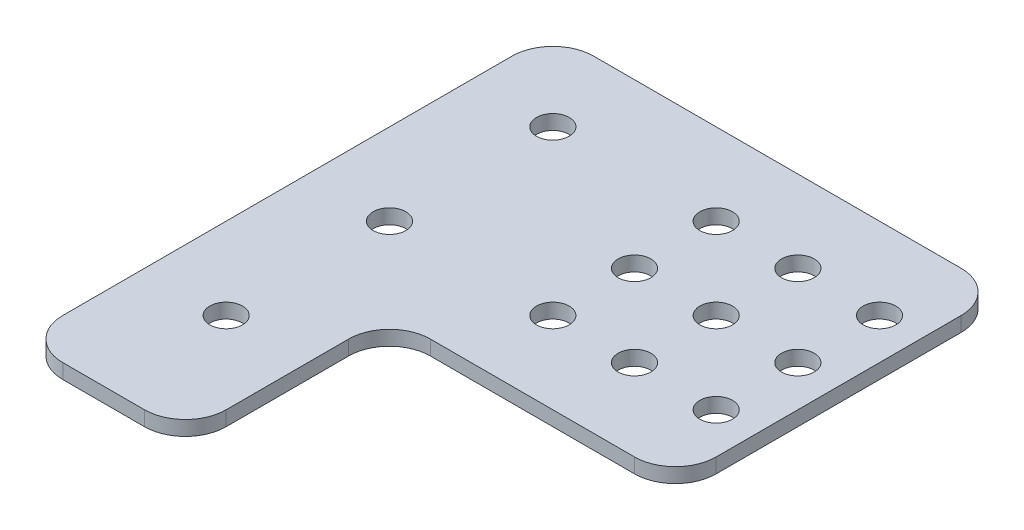
ISO-10303-21;
HEADER;
FILE_DESCRIPTION(('STEP AP214'),'2;1');
FILE_NAME('part.step','',(''),(''),'','','');
FILE_SCHEMA(('AUTOMOTIVE_DESIGN { 1 0 10303 214 1 1 1 1 }'));
ENDSEC;
DATA;
#1=APPLICATION_CONTEXT('core data for automotive mechanical design processes');
#2=APPLICATION_PROTOCOL_DEFINITION('international standard','automotive_design',2000,#1);
#3=PRODUCT_CONTEXT('',#1,'mechanical');
#4=PRODUCT('Part','Part','',(#3));
#5=PRODUCT_RELATED_PRODUCT_CATEGORY('part','',(#4));
#6=PRODUCT_DEFINITION_FORMATION('','',#4);
#7=PRODUCT_DEFINITION_CONTEXT('part definition',#1,'design');
#8=PRODUCT_DEFINITION('design','',#6,#7);
#9=PRODUCT_DEFINITION_SHAPE('','',#8);
#10=(LENGTH_UNIT() NAMED_UNIT(*) SI_UNIT(.MILLI.,.METRE.));
#11=(NAMED_UNIT(*) PLANE_ANGLE_UNIT() SI_UNIT($,.RADIAN.));
#12=(NAMED_UNIT(*) SI_UNIT($,.STERADIAN.) SOLID_ANGLE_UNIT());
#13=UNCERTAINTY_MEASURE_WITH_UNIT(LENGTH_MEASURE(1.E-05),#10,'distance_accuracy_value','');
#14=(GEOMETRIC_REPRESENTATION_CONTEXT(3) GLOBAL_UNCERTAINTY_ASSIGNED_CONTEXT((#13)) GLOBAL_UNIT_ASSIGNED_CONTEXT((#10,
#11,#12)) REPRESENTATION_CONTEXT('',''));
#15=CARTESIAN_POINT('',(0.,0.,0.));
#16=DIRECTION('',(0.,0.,1.));
#17=DIRECTION('',(1.,0.,0.));
#18=AXIS2_PLACEMENT_3D('',#15,#16,#17);
#19=CARTESIAN_POINT('',(0.,2.286,0.));
#20=DIRECTION('',(0.,1.,0.));
#21=DIRECTION('',(0.,0.,1.));
#22=AXIS2_PLACEMENT_3D('',#19,#20,#21);
#23=PLANE('',#22);
#24=DIRECTION('',(-1.,0.,0.));
#25=VECTOR('',#24,1.);
#26=CARTESIAN_POINT('',(69.85,2.286,-82.55));
#27=LINE('',#26,#25);
#28=CARTESIAN_POINT('',(63.5,2.286,-82.55));
#29=VERTEX_POINT('',#28);
#30=CARTESIAN_POINT('',(6.35000000000002,2.286,-82.55));
#31=VERTEX_POINT('',#30);
#32=EDGE_CURVE('E132',#29,#31,#27,.T.);
#33=ORIENTED_EDGE('',*,*,#32,.T.);
#34=CARTESIAN_POINT('',(6.34999999999999,2.286,-76.2));
#35=DIRECTION('',(0.,1.,0.));
#36=DIRECTION('',(0.,0.,1.));
#37=AXIS2_PLACEMENT_3D('',#34,#35,#36);
#38=CIRCLE('',#37,6.35);
#39=CARTESIAN_POINT('',(0.,2.286,-76.2));
#40=VERTEX_POINT('',#39);
#41=EDGE_CURVE('E126',#31,#40,#38,.T.);
#42=ORIENTED_EDGE('',*,*,#41,.T.);
#43=DIRECTION('',(0.,0.,1.));
#44=VECTOR('',#43,1.);
#45=CARTESIAN_POINT('',(0.,2.286,-114.3));
#46=LINE('',#45,#44);
#47=CARTESIAN_POINT('',(0.,2.286,-6.34999999999999));
#48=VERTEX_POINT('',#47);
#49=EDGE_CURVE('E129',#40,#48,#46,.T.);
#50=ORIENTED_EDGE('',*,*,#49,.T.);
#51=CARTESIAN_POINT('',(6.35,2.286,-6.35));
#52=DIRECTION('',(0.,1.,0.));
#53=DIRECTION('',(0.,0.,1.));
#54=AXIS2_PLACEMENT_3D('',#51,#52,#53);
#55=CIRCLE('',#54,6.35);
#56=CARTESIAN_POINT('',(6.35,2.286,0.));
#57=VERTEX_POINT('',#56);
#58=EDGE_CURVE('E170',#48,#57,#55,.T.);
#59=ORIENTED_EDGE('',*,*,#58,.T.);
#60=DIRECTION('',(1.,0.,0.));
#61=VECTOR('',#60,1.);
#62=CARTESIAN_POINT('',(0.,2.286,0.));
#63=LINE('',#62,#61);
#64=CARTESIAN_POINT('',(19.05,2.286,0.));
#65=VERTEX_POINT('',#64);
#66=EDGE_CURVE('E147',#57,#65,#63,.T.);
#67=ORIENTED_EDGE('',*,*,#66,.T.);
#68=CARTESIAN_POINT('',(19.05,2.286,-6.35));
#69=DIRECTION('',(0.,1.,0.));
#70=DIRECTION('',(0.,0.,1.));
#71=AXIS2_PLACEMENT_3D('',#68,#69,#70);
#72=CIRCLE('',#71,6.35);
#73=CARTESIAN_POINT('',(25.4,2.286,-6.35));
#74=VERTEX_POINT('',#73);
#75=EDGE_CURVE('E172',#65,#74,#72,.T.);
#76=ORIENTED_EDGE('',*,*,#75,.T.);
#77=DIRECTION('',(0.,0.,-1.));
#78=VECTOR('',#77,1.);
#79=CARTESIAN_POINT('',(25.4,2.286,0.));
#80=LINE('',#79,#78);
#81=CARTESIAN_POINT('',(25.4,2.286,-25.4));
#82=VERTEX_POINT('',#81);
#83=EDGE_CURVE('E216',#74,#82,#80,.T.);
#84=ORIENTED_EDGE('',*,*,#83,.T.);
#85=CARTESIAN_POINT('',(31.75,2.286,-25.4));
#86=DIRECTION('',(0.,1.,0.));
#87=DIRECTION('',(0.,0.,1.));
#88=AXIS2_PLACEMENT_3D('',#85,#86,#87);
#89=CIRCLE('',#88,6.35);
#90=CARTESIAN_POINT('',(31.75,2.286,-31.75));
#91=VERTEX_POINT('',#90);
#92=EDGE_CURVE('E11',#82,#91,#89,.F.);
#93=ORIENTED_EDGE('',*,*,#92,.T.);
#94=DIRECTION('',(1.,0.,0.));
#95=VECTOR('',#94,1.);
#96=CARTESIAN_POINT('',(25.4,2.286,-31.75));
#97=LINE('',#96,#95);
#98=CARTESIAN_POINT('',(63.5,2.286,-31.75));
#99=VERTEX_POINT('',#98);
#100=EDGE_CURVE('E215',#91,#99,#97,.T.);
#101=ORIENTED_EDGE('',*,*,#100,.T.);
#102=CARTESIAN_POINT('',(63.5,2.286,-38.1));
#103=DIRECTION('',(0.,1.,0.));
#104=DIRECTION('',(0.,0.,1.));
#105=AXIS2_PLACEMENT_3D('',#102,#103,#104);
#106=CIRCLE('',#105,6.35);
#107=CARTESIAN_POINT('',(69.85,2.286,-38.1));
#108=VERTEX_POINT('',#107);
#109=EDGE_CURVE('E58',#99,#108,#106,.T.);
#110=ORIENTED_EDGE('',*,*,#109,.T.);
#111=DIRECTION('',(0.,0.,-1.));
#112=VECTOR('',#111,1.);
#113=CARTESIAN_POINT('',(69.85,2.286,-31.75));
#114=LINE('',#113,#112);
#115=CARTESIAN_POINT('',(69.85,2.286,-76.2));
#116=VERTEX_POINT('',#115);
#117=EDGE_CURVE('E220',#108,#116,#114,.T.);
#118=ORIENTED_EDGE('',*,*,#117,.T.);
#119=CARTESIAN_POINT('',(63.5,2.286,-76.2));
#120=DIRECTION('',(0.,1.,0.));
#121=DIRECTION('',(0.,0.,1.));
#122=AXIS2_PLACEMENT_3D('',#119,#120,#121);
#123=CIRCLE('',#122,6.35);
#124=EDGE_CURVE('E137',#116,#29,#123,.T.);
#125=ORIENTED_EDGE('',*,*,#124,.T.);
#126=EDGE_LOOP('',(#33,#42,#50,#59,#67,#76,#84,#93,#101,#110,#118,#125));
#127=FACE_BOUND('',#126,.T.);
#128=CARTESIAN_POINT('',(38.1000000000001,2.286,-57.15));
#129=DIRECTION('',(0.,1.,0.));
#130=DIRECTION('',(0.,0.,1.));
#131=AXIS2_PLACEMENT_3D('',#128,#129,#130);
#132=CIRCLE('',#131,2.53999999999999);
#133=CARTESIAN_POINT('',(38.1000000000001,2.286,-54.61));
#134=VERTEX_POINT('',#133);
#135=EDGE_CURVE('E307',#134,#134,#132,.T.);
#136=ORIENTED_EDGE('',*,*,#135,.F.);
#137=EDGE_LOOP('',(#136));
#138=FACE_BOUND('',#137,.T.);
#139=CARTESIAN_POINT('',(50.8000000000002,2.286,-44.45));
#140=DIRECTION('',(0.,1.,0.));
#141=DIRECTION('',(0.,0.,1.));
#142=AXIS2_PLACEMENT_3D('',#139,#140,#141);
#143=CIRCLE('',#142,2.54);
#144=CARTESIAN_POINT('',(50.8000000000002,2.286,-41.91));
#145=VERTEX_POINT('',#144);
#146=EDGE_CURVE('E295',#145,#145,#143,.T.);
#147=ORIENTED_EDGE('',*,*,#146,.F.);
#148=EDGE_LOOP('',(#147));
#149=FACE_BOUND('',#148,.T.);
#150=CARTESIAN_POINT('',(50.8000000000001,2.286,-57.15));
#151=DIRECTION('',(0.,1.,0.));
#152=DIRECTION('',(0.,0.,1.));
#153=AXIS2_PLACEMENT_3D('',#150,#151,#152);
#154=CIRCLE('',#153,2.53999999999999);
#155=CARTESIAN_POINT('',(50.8000000000001,2.286,-54.61));
#156=VERTEX_POINT('',#155);
#157=EDGE_CURVE('E283',#156,#156,#154,.T.);
#158=ORIENTED_EDGE('',*,*,#157,.F.);
#159=EDGE_LOOP('',(#158));
#160=FACE_BOUND('',#159,.T.);
#161=CARTESIAN_POINT('',(50.8,2.286,-69.85));
#162=DIRECTION('',(0.,1.,0.));
#163=DIRECTION('',(0.,0.,1.));
#164=AXIS2_PLACEMENT_3D('',#161,#162,#163);
#165=CIRCLE('',#164,2.53999999999999);
#166=CARTESIAN_POINT('',(50.8,2.286,-67.31));
#167=VERTEX_POINT('',#166);
#168=EDGE_CURVE('E271',#167,#167,#165,.T.);
#169=ORIENTED_EDGE('',*,*,#168,.F.);
#170=EDGE_LOOP('',(#169));
#171=FACE_BOUND('',#170,.T.);
#172=CARTESIAN_POINT('',(12.7,2.286,-44.45));
#173=DIRECTION('',(0.,1.,0.));
#174=DIRECTION('',(0.,0.,1.));
#175=AXIS2_PLACEMENT_3D('',#172,#173,#174);
#176=CIRCLE('',#175,2.54);
#177=CARTESIAN_POINT('',(12.7,2.286,-41.91));
#178=VERTEX_POINT('',#177);
#179=EDGE_CURVE('E259',#178,#178,#176,.T.);
#180=ORIENTED_EDGE('',*,*,#179,.F.);
#181=EDGE_LOOP('',(#180));
#182=FACE_BOUND('',#181,.T.);
#183=CARTESIAN_POINT('',(38.1,2.286,-69.85));
#184=DIRECTION('',(0.,1.,0.));
#185=DIRECTION('',(0.,0.,1.));
#186=AXIS2_PLACEMENT_3D('',#183,#184,#185);
#187=CIRCLE('',#186,2.53999999999999);
#188=CARTESIAN_POINT('',(38.1,2.286,-67.31));
#189=VERTEX_POINT('',#188);
#190=EDGE_CURVE('E229',#189,#189,#187,.T.);
#191=ORIENTED_EDGE('',*,*,#190,.F.);
#192=EDGE_LOOP('',(#191));
#193=FACE_BOUND('',#192,.T.);
#194=CARTESIAN_POINT('',(12.7,2.286,-69.85));
#195=DIRECTION('',(0.,1.,0.));
#196=DIRECTION('',(0.,0.,1.));
#197=AXIS2_PLACEMENT_3D('',#194,#195,#196);
#198=CIRCLE('',#197,2.53999999999999);
#199=CARTESIAN_POINT('',(12.7,2.286,-67.31));
#200=VERTEX_POINT('',#199);
#201=EDGE_CURVE('E253',#200,#200,#198,.T.);
#202=ORIENTED_EDGE('',*,*,#201,.F.);
#203=EDGE_LOOP('',(#202));
#204=FACE_BOUND('',#203,.T.);
#205=CARTESIAN_POINT('',(12.7,2.286,-19.05));
#206=DIRECTION('',(0.,1.,0.));
#207=DIRECTION('',(0.,0.,1.));
#208=AXIS2_PLACEMENT_3D('',#205,#206,#207);
#209=CIRCLE('',#208,2.53999999999999);
#210=CARTESIAN_POINT('',(12.7,2.286,-16.51));
#211=VERTEX_POINT('',#210);
#212=EDGE_CURVE('E265',#211,#211,#209,.T.);
#213=ORIENTED_EDGE('',*,*,#212,.F.);
#214=EDGE_LOOP('',(#213));
#215=FACE_BOUND('',#214,.T.);
#216=CARTESIAN_POINT('',(63.5,2.286,-69.85));
#217=DIRECTION('',(0.,1.,0.));
#218=DIRECTION('',(0.,0.,1.));
#219=AXIS2_PLACEMENT_3D('',#216,#217,#218);
#220=CIRCLE('',#219,2.54000000000001);
#221=CARTESIAN_POINT('',(63.5,2.286,-67.31));
#222=VERTEX_POINT('',#221);
#223=EDGE_CURVE('E277',#222,#222,#220,.T.);
#224=ORIENTED_EDGE('',*,*,#223,.F.);
#225=EDGE_LOOP('',(#224));
#226=FACE_BOUND('',#225,.T.);
#227=CARTESIAN_POINT('',(63.5000000000001,2.286,-57.15));
#228=DIRECTION('',(0.,1.,0.));
#229=DIRECTION('',(0.,0.,1.));
#230=AXIS2_PLACEMENT_3D('',#227,#228,#229);
#231=CIRCLE('',#230,2.53999999999999);
#232=CARTESIAN_POINT('',(63.5000000000001,2.286,-54.61));
#233=VERTEX_POINT('',#232);
#234=EDGE_CURVE('E289',#233,#233,#231,.T.);
#235=ORIENTED_EDGE('',*,*,#234,.F.);
#236=EDGE_LOOP('',(#235));
#237=FACE_BOUND('',#236,.T.);
#238=CARTESIAN_POINT('',(63.5000000000002,2.286,-44.45));
#239=DIRECTION('',(0.,1.,0.));
#240=DIRECTION('',(0.,0.,1.));
#241=AXIS2_PLACEMENT_3D('',#238,#239,#240);
#242=CIRCLE('',#241,2.53999999999998);
#243=CARTESIAN_POINT('',(63.5000000000002,2.286,-41.91));
#244=VERTEX_POINT('',#243);
#245=EDGE_CURVE('E301',#244,#244,#242,.T.);
#246=ORIENTED_EDGE('',*,*,#245,.F.);
#247=EDGE_LOOP('',(#246));
#248=FACE_BOUND('',#247,.T.);
#249=CARTESIAN_POINT('',(38.1000000000002,2.286,-44.45));
#250=DIRECTION('',(0.,1.,0.));
#251=DIRECTION('',(0.,0.,1.));
#252=AXIS2_PLACEMENT_3D('',#249,#250,#251);
#253=CIRCLE('',#252,2.54);
#254=CARTESIAN_POINT('',(38.1000000000002,2.286,-41.91));
#255=VERTEX_POINT('',#254);
#256=EDGE_CURVE('E313',#255,#255,#253,.T.);
#257=ORIENTED_EDGE('',*,*,#256,.F.);
#258=EDGE_LOOP('',(#257));
#259=FACE_BOUND('',#258,.T.);
#260=ADVANCED_FACE('F36',(#127,#138,#149,#160,#171,#182,#193,#204,#215,#226,#237,#248,#259),#23,.T.);
#261=CARTESIAN_POINT('',(0.,0.,0.));
#262=DIRECTION('',(0.,1.,0.));
#263=DIRECTION('',(0.,0.,1.));
#264=AXIS2_PLACEMENT_3D('',#261,#262,#263);
#265=PLANE('',#264);
#266=DIRECTION('',(0.,0.,1.));
#267=VECTOR('',#266,1.);
#268=CARTESIAN_POINT('',(0.,0.,-114.3));
#269=LINE('',#268,#267);
#270=CARTESIAN_POINT('',(0.,0.,-76.2));
#271=VERTEX_POINT('',#270);
#272=CARTESIAN_POINT('',(0.,0.,-6.34999999999999));
#273=VERTEX_POINT('',#272);
#274=EDGE_CURVE('E227',#271,#273,#269,.T.);
#275=ORIENTED_EDGE('',*,*,#274,.F.);
#276=CARTESIAN_POINT('',(6.34999999999999,0.,-76.2));
#277=DIRECTION('',(0.,1.,0.));
#278=DIRECTION('',(0.,0.,1.));
#279=AXIS2_PLACEMENT_3D('',#276,#277,#278);
#280=CIRCLE('',#279,6.35);
#281=CARTESIAN_POINT('',(6.35000000000002,0.,-82.55));
#282=VERTEX_POINT('',#281);
#283=EDGE_CURVE('E151',#271,#282,#280,.F.);
#284=ORIENTED_EDGE('',*,*,#283,.T.);
#285=DIRECTION('',(-1.,0.,0.));
#286=VECTOR('',#285,1.);
#287=CARTESIAN_POINT('',(69.85,0.,-82.55));
#288=LINE('',#287,#286);
#289=CARTESIAN_POINT('',(63.5,0.,-82.55));
#290=VERTEX_POINT('',#289);
#291=EDGE_CURVE('E148',#290,#282,#288,.T.);
#292=ORIENTED_EDGE('',*,*,#291,.F.);
#293=CARTESIAN_POINT('',(63.5,0.,-76.2));
#294=DIRECTION('',(0.,1.,0.));
#295=DIRECTION('',(0.,0.,1.));
#296=AXIS2_PLACEMENT_3D('',#293,#294,#295);
#297=CIRCLE('',#296,6.35);
#298=CARTESIAN_POINT('',(69.85,0.,-76.2));
#299=VERTEX_POINT('',#298);
#300=EDGE_CURVE('E162',#290,#299,#297,.F.);
#301=ORIENTED_EDGE('',*,*,#300,.T.);
#302=DIRECTION('',(0.,0.,-1.));
#303=VECTOR('',#302,1.);
#304=CARTESIAN_POINT('',(69.85,0.,-31.75));
#305=LINE('',#304,#303);
#306=CARTESIAN_POINT('',(69.85,0.,-38.1));
#307=VERTEX_POINT('',#306);
#308=EDGE_CURVE('E233',#307,#299,#305,.T.);
#309=ORIENTED_EDGE('',*,*,#308,.F.);
#310=CARTESIAN_POINT('',(63.5,0.,-38.1));
#311=DIRECTION('',(0.,1.,0.));
#312=DIRECTION('',(0.,0.,1.));
#313=AXIS2_PLACEMENT_3D('',#310,#311,#312);
#314=CIRCLE('',#313,6.35);
#315=CARTESIAN_POINT('',(63.5,0.,-31.75));
#316=VERTEX_POINT('',#315);
#317=EDGE_CURVE('E160',#307,#316,#314,.F.);
#318=ORIENTED_EDGE('',*,*,#317,.T.);
#319=DIRECTION('',(1.,0.,0.));
#320=VECTOR('',#319,1.);
#321=CARTESIAN_POINT('',(25.4,0.,-31.75));
#322=LINE('',#321,#320);
#323=CARTESIAN_POINT('',(31.75,0.,-31.75));
#324=VERTEX_POINT('',#323);
#325=EDGE_CURVE('E201',#324,#316,#322,.T.);
#326=ORIENTED_EDGE('',*,*,#325,.F.);
#327=CARTESIAN_POINT('',(31.75,0.,-25.4));
#328=DIRECTION('',(0.,1.,0.));
#329=DIRECTION('',(0.,0.,1.));
#330=AXIS2_PLACEMENT_3D('',#327,#328,#329);
#331=CIRCLE('',#330,6.35);
#332=CARTESIAN_POINT('',(25.4,0.,-25.4));
#333=VERTEX_POINT('',#332);
#334=EDGE_CURVE('E44',#324,#333,#331,.T.);
#335=ORIENTED_EDGE('',*,*,#334,.T.);
#336=DIRECTION('',(0.,0.,-1.));
#337=VECTOR('',#336,1.);
#338=CARTESIAN_POINT('',(25.4,0.,0.));
#339=LINE('',#338,#337);
#340=CARTESIAN_POINT('',(25.4,0.,-6.35));
#341=VERTEX_POINT('',#340);
#342=EDGE_CURVE('E199',#341,#333,#339,.T.);
#343=ORIENTED_EDGE('',*,*,#342,.F.);
#344=CARTESIAN_POINT('',(19.05,0.,-6.35));
#345=DIRECTION('',(0.,1.,0.));
#346=DIRECTION('',(0.,0.,1.));
#347=AXIS2_PLACEMENT_3D('',#344,#345,#346);
#348=CIRCLE('',#347,6.35);
#349=CARTESIAN_POINT('',(19.05,0.,0.));
#350=VERTEX_POINT('',#349);
#351=EDGE_CURVE('E154',#341,#350,#348,.F.);
#352=ORIENTED_EDGE('',*,*,#351,.T.);
#353=DIRECTION('',(1.,0.,0.));
#354=VECTOR('',#353,1.);
#355=CARTESIAN_POINT('',(0.,0.,0.));
#356=LINE('',#355,#354);
#357=CARTESIAN_POINT('',(6.35,0.,0.));
#358=VERTEX_POINT('',#357);
#359=EDGE_CURVE('E210',#358,#350,#356,.T.);
#360=ORIENTED_EDGE('',*,*,#359,.F.);
#361=CARTESIAN_POINT('',(6.35,0.,-6.35));
#362=DIRECTION('',(0.,1.,0.));
#363=DIRECTION('',(0.,0.,1.));
#364=AXIS2_PLACEMENT_3D('',#361,#362,#363);
#365=CIRCLE('',#364,6.35);
#366=EDGE_CURVE('E152',#358,#273,#365,.F.);
#367=ORIENTED_EDGE('',*,*,#366,.T.);
#368=EDGE_LOOP('',(#275,#284,#292,#301,#309,#318,#326,#335,#343,#352,#360,#367));
#369=FACE_BOUND('',#368,.T.);
#370=CARTESIAN_POINT('',(38.1,0.,-69.85));
#371=DIRECTION('',(0.,1.,0.));
#372=DIRECTION('',(0.,0.,1.));
#373=AXIS2_PLACEMENT_3D('',#370,#371,#372);
#374=CIRCLE('',#373,2.53999999999999);
#375=CARTESIAN_POINT('',(38.1,0.,-67.31));
#376=VERTEX_POINT('',#375);
#377=EDGE_CURVE('E250',#376,#376,#374,.T.);
#378=ORIENTED_EDGE('',*,*,#377,.T.);
#379=EDGE_LOOP('',(#378));
#380=FACE_BOUND('',#379,.T.);
#381=CARTESIAN_POINT('',(12.7,0.,-69.85));
#382=DIRECTION('',(0.,1.,0.));
#383=DIRECTION('',(0.,0.,1.));
#384=AXIS2_PLACEMENT_3D('',#381,#382,#383);
#385=CIRCLE('',#384,2.53999999999999);
#386=CARTESIAN_POINT('',(12.7,0.,-67.31));
#387=VERTEX_POINT('',#386);
#388=EDGE_CURVE('E256',#387,#387,#385,.T.);
#389=ORIENTED_EDGE('',*,*,#388,.T.);
#390=EDGE_LOOP('',(#389));
#391=FACE_BOUND('',#390,.T.);
#392=CARTESIAN_POINT('',(12.7,0.,-44.45));
#393=DIRECTION('',(0.,1.,0.));
#394=DIRECTION('',(0.,0.,1.));
#395=AXIS2_PLACEMENT_3D('',#392,#393,#394);
#396=CIRCLE('',#395,2.54);
#397=CARTESIAN_POINT('',(12.7,0.,-41.91));
#398=VERTEX_POINT('',#397);
#399=EDGE_CURVE('E262',#398,#398,#396,.T.);
#400=ORIENTED_EDGE('',*,*,#399,.T.);
#401=EDGE_LOOP('',(#400));
#402=FACE_BOUND('',#401,.T.);
#403=CARTESIAN_POINT('',(12.7,0.,-19.05));
#404=DIRECTION('',(0.,1.,0.));
#405=DIRECTION('',(0.,0.,1.));
#406=AXIS2_PLACEMENT_3D('',#403,#404,#405);
#407=CIRCLE('',#406,2.53999999999999);
#408=CARTESIAN_POINT('',(12.7,0.,-16.51));
#409=VERTEX_POINT('',#408);
#410=EDGE_CURVE('E268',#409,#409,#407,.T.);
#411=ORIENTED_EDGE('',*,*,#410,.T.);
#412=EDGE_LOOP('',(#411));
#413=FACE_BOUND('',#412,.T.);
#414=CARTESIAN_POINT('',(50.8,0.,-69.85));
#415=DIRECTION('',(0.,1.,0.));
#416=DIRECTION('',(0.,0.,1.));
#417=AXIS2_PLACEMENT_3D('',#414,#415,#416);
#418=CIRCLE('',#417,2.53999999999999);
#419=CARTESIAN_POINT('',(50.8,0.,-67.31));
#420=VERTEX_POINT('',#419);
#421=EDGE_CURVE('E274',#420,#420,#418,.T.);
#422=ORIENTED_EDGE('',*,*,#421,.T.);
#423=EDGE_LOOP('',(#422));
#424=FACE_BOUND('',#423,.T.);
#425=CARTESIAN_POINT('',(63.5,0.,-69.85));
#426=DIRECTION('',(0.,1.,0.));
#427=DIRECTION('',(0.,0.,1.));
#428=AXIS2_PLACEMENT_3D('',#425,#426,#427);
#429=CIRCLE('',#428,2.54000000000001);
#430=CARTESIAN_POINT('',(63.5,0.,-67.31));
#431=VERTEX_POINT('',#430);
#432=EDGE_CURVE('E280',#431,#431,#429,.T.);
#433=ORIENTED_EDGE('',*,*,#432,.T.);
#434=EDGE_LOOP('',(#433));
#435=FACE_BOUND('',#434,.T.);
#436=CARTESIAN_POINT('',(50.8000000000001,0.,-57.15));
#437=DIRECTION('',(0.,1.,0.));
#438=DIRECTION('',(0.,0.,1.));
#439=AXIS2_PLACEMENT_3D('',#436,#437,#438);
#440=CIRCLE('',#439,2.53999999999999);
#441=CARTESIAN_POINT('',(50.8000000000001,0.,-54.61));
#442=VERTEX_POINT('',#441);
#443=EDGE_CURVE('E286',#442,#442,#440,.T.);
#444=ORIENTED_EDGE('',*,*,#443,.T.);
#445=EDGE_LOOP('',(#444));
#446=FACE_BOUND('',#445,.T.);
#447=CARTESIAN_POINT('',(63.5000000000001,0.,-57.15));
#448=DIRECTION('',(0.,1.,0.));
#449=DIRECTION('',(0.,0.,1.));
#450=AXIS2_PLACEMENT_3D('',#447,#448,#449);
#451=CIRCLE('',#450,2.53999999999999);
#452=CARTESIAN_POINT('',(63.5000000000001,0.,-54.61));
#453=VERTEX_POINT('',#452);
#454=EDGE_CURVE('E292',#453,#453,#451,.T.);
#455=ORIENTED_EDGE('',*,*,#454,.T.);
#456=EDGE_LOOP('',(#455));
#457=FACE_BOUND('',#456,.T.);
#458=CARTESIAN_POINT('',(50.8000000000002,0.,-44.45));
#459=DIRECTION('',(0.,1.,0.));
#460=DIRECTION('',(0.,0.,1.));
#461=AXIS2_PLACEMENT_3D('',#458,#459,#460);
#462=CIRCLE('',#461,2.54);
#463=CARTESIAN_POINT('',(50.8000000000002,0.,-41.91));
#464=VERTEX_POINT('',#463);
#465=EDGE_CURVE('E298',#464,#464,#462,.T.);
#466=ORIENTED_EDGE('',*,*,#465,.T.);
#467=EDGE_LOOP('',(#466));
#468=FACE_BOUND('',#467,.T.);
#469=CARTESIAN_POINT('',(63.5000000000002,0.,-44.45));
#470=DIRECTION('',(0.,1.,0.));
#471=DIRECTION('',(0.,0.,1.));
#472=AXIS2_PLACEMENT_3D('',#469,#470,#471);
#473=CIRCLE('',#472,2.53999999999998);
#474=CARTESIAN_POINT('',(63.5000000000002,0.,-41.91));
#475=VERTEX_POINT('',#474);
#476=EDGE_CURVE('E304',#475,#475,#473,.T.);
#477=ORIENTED_EDGE('',*,*,#476,.T.);
#478=EDGE_LOOP('',(#477));
#479=FACE_BOUND('',#478,.T.);
#480=CARTESIAN_POINT('',(38.1000000000001,0.,-57.15));
#481=DIRECTION('',(0.,1.,0.));
#482=DIRECTION('',(0.,0.,1.));
#483=AXIS2_PLACEMENT_3D('',#480,#481,#482);
#484=CIRCLE('',#483,2.53999999999999);
#485=CARTESIAN_POINT('',(38.1000000000001,0.,-54.61));
#486=VERTEX_POINT('',#485);
#487=EDGE_CURVE('E310',#486,#486,#484,.T.);
#488=ORIENTED_EDGE('',*,*,#487,.T.);
#489=EDGE_LOOP('',(#488));
#490=FACE_BOUND('',#489,.T.);
#491=CARTESIAN_POINT('',(38.1000000000002,0.,-44.45));
#492=DIRECTION('',(0.,1.,0.));
#493=DIRECTION('',(0.,0.,1.));
#494=AXIS2_PLACEMENT_3D('',#491,#492,#493);
#495=CIRCLE('',#494,2.54);
#496=CARTESIAN_POINT('',(38.1000000000002,0.,-41.91));
#497=VERTEX_POINT('',#496);
#498=EDGE_CURVE('E316',#497,#497,#495,.T.);
#499=ORIENTED_EDGE('',*,*,#498,.T.);
#500=EDGE_LOOP('',(#499));
#501=FACE_BOUND('',#500,.T.);
#502=ADVANCED_FACE('F197',(#369,#380,#391,#402,#413,#424,#435,#446,#457,#468,#479,#490,#501),
#265,.F.);
#503=CARTESIAN_POINT('',(0.,2.286,-114.3));
#504=DIRECTION('',(1.,0.,0.));
#505=DIRECTION('',(0.,0.,-1.));
#506=AXIS2_PLACEMENT_3D('',#503,#504,#505);
#507=PLANE('',#506);
#508=ORIENTED_EDGE('',*,*,#49,.F.);
#509=DIRECTION('',(0.,-1.,0.));
#510=VECTOR('',#509,1.);
#511=CARTESIAN_POINT('',(0.,2.286,-76.2));
#512=LINE('',#511,#510);
#513=EDGE_CURVE('E143',#40,#271,#512,.T.);
#514=ORIENTED_EDGE('',*,*,#513,.T.);
#515=ORIENTED_EDGE('',*,*,#274,.T.);
#516=DIRECTION('',(0.,-1.,0.));
#517=VECTOR('',#516,1.);
#518=CARTESIAN_POINT('',(0.,2.286,-6.34999999999999));
#519=LINE('',#518,#517);
#520=EDGE_CURVE('E146',#273,#48,#519,.F.);
#521=ORIENTED_EDGE('',*,*,#520,.T.);
#522=EDGE_LOOP('',(#508,#514,#515,#521));
#523=FACE_BOUND('',#522,.T.);
#524=ADVANCED_FACE('F141',(#523),#507,.F.);
#525=CARTESIAN_POINT('',(0.,2.286,0.));
#526=DIRECTION('',(0.,0.,-1.));
#527=DIRECTION('',(-1.,0.,0.));
#528=AXIS2_PLACEMENT_3D('',#525,#526,#527);
#529=PLANE('',#528);
#530=ORIENTED_EDGE('',*,*,#359,.T.);
#531=DIRECTION('',(0.,-1.,0.));
#532=VECTOR('',#531,1.);
#533=CARTESIAN_POINT('',(19.05,2.286,0.));
#534=LINE('',#533,#532);
#535=EDGE_CURVE('E192',#350,#65,#534,.F.);
#536=ORIENTED_EDGE('',*,*,#535,.T.);
#537=ORIENTED_EDGE('',*,*,#66,.F.);
#538=DIRECTION('',(0.,-1.,0.));
#539=VECTOR('',#538,1.);
#540=CARTESIAN_POINT('',(6.35,2.286,0.));
#541=LINE('',#540,#539);
#542=EDGE_CURVE('E189',#57,#358,#541,.T.);
#543=ORIENTED_EDGE('',*,*,#542,.T.);
#544=EDGE_LOOP('',(#530,#536,#537,#543));
#545=FACE_BOUND('',#544,.T.);
#546=ADVANCED_FACE('F247',(#545),#529,.F.);
#547=CARTESIAN_POINT('',(25.4,2.286,0.));
#548=DIRECTION('',(-1.,0.,0.));
#549=DIRECTION('',(0.,0.,1.));
#550=AXIS2_PLACEMENT_3D('',#547,#548,#549);
#551=PLANE('',#550);
#552=ORIENTED_EDGE('',*,*,#342,.T.);
#553=DIRECTION('',(0.,-1.,0.));
#554=VECTOR('',#553,1.);
#555=CARTESIAN_POINT('',(25.4,2.286,-25.4));
#556=LINE('',#555,#554);
#557=EDGE_CURVE('E187',#333,#82,#556,.F.);
#558=ORIENTED_EDGE('',*,*,#557,.T.);
#559=ORIENTED_EDGE('',*,*,#83,.F.);
#560=DIRECTION('',(0.,-1.,0.));
#561=VECTOR('',#560,1.);
#562=CARTESIAN_POINT('',(25.4,2.286,-6.35));
#563=LINE('',#562,#561);
#564=EDGE_CURVE('E184',#74,#341,#563,.T.);
#565=ORIENTED_EDGE('',*,*,#564,.T.);
#566=EDGE_LOOP('',(#552,#558,#559,#565));
#567=FACE_BOUND('',#566,.T.);
#568=ADVANCED_FACE('F206',(#567),#551,.F.);
#569=CARTESIAN_POINT('',(25.4,2.286,-31.75));
#570=DIRECTION('',(0.,0.,-1.));
#571=DIRECTION('',(-1.,0.,0.));
#572=AXIS2_PLACEMENT_3D('',#569,#570,#571);
#573=PLANE('',#572);
#574=ORIENTED_EDGE('',*,*,#325,.T.);
#575=DIRECTION('',(0.,-1.,0.));
#576=VECTOR('',#575,1.);
#577=CARTESIAN_POINT('',(63.5,2.286,-31.75));
#578=LINE('',#577,#576);
#579=EDGE_CURVE('E182',#316,#99,#578,.F.);
#580=ORIENTED_EDGE('',*,*,#579,.T.);
#581=ORIENTED_EDGE('',*,*,#100,.F.);
#582=DIRECTION('',(0.,-1.,0.));
#583=VECTOR('',#582,1.);
#584=CARTESIAN_POINT('',(31.75,0.,-31.75));
#585=LINE('',#584,#583);
#586=EDGE_CURVE('E179',#91,#324,#585,.T.);
#587=ORIENTED_EDGE('',*,*,#586,.T.);
#588=EDGE_LOOP('',(#574,#580,#581,#587));
#589=FACE_BOUND('',#588,.T.);
#590=ADVANCED_FACE('F218',(#589),#573,.F.);
#591=CARTESIAN_POINT('',(69.85,2.286,-31.75));
#592=DIRECTION('',(-1.,0.,0.));
#593=DIRECTION('',(0.,0.,1.));
#594=AXIS2_PLACEMENT_3D('',#591,#592,#593);
#595=PLANE('',#594);
#596=ORIENTED_EDGE('',*,*,#308,.T.);
#597=DIRECTION('',(0.,-1.,0.));
#598=VECTOR('',#597,1.);
#599=CARTESIAN_POINT('',(69.85,2.286,-76.2));
#600=LINE('',#599,#598);
#601=EDGE_CURVE('E51',#299,#116,#600,.F.);
#602=ORIENTED_EDGE('',*,*,#601,.T.);
#603=ORIENTED_EDGE('',*,*,#117,.F.);
#604=DIRECTION('',(0.,-1.,0.));
#605=VECTOR('',#604,1.);
#606=CARTESIAN_POINT('',(69.85,2.286,-38.1));
#607=LINE('',#606,#605);
#608=EDGE_CURVE('E136',#108,#307,#607,.T.);
#609=ORIENTED_EDGE('',*,*,#608,.T.);
#610=EDGE_LOOP('',(#596,#602,#603,#609));
#611=FACE_BOUND('',#610,.T.);
#612=ADVANCED_FACE('F337',(#611),#595,.F.);
#613=CARTESIAN_POINT('',(69.85,2.286,-82.55));
#614=DIRECTION('',(0.,0.,1.));
#615=DIRECTION('',(1.,0.,0.));
#616=AXIS2_PLACEMENT_3D('',#613,#614,#615);
#617=PLANE('',#616);
#618=ORIENTED_EDGE('',*,*,#291,.T.);
#619=DIRECTION('',(0.,-1.,0.));
#620=VECTOR('',#619,1.);
#621=CARTESIAN_POINT('',(6.34999999999999,2.286,-82.55));
#622=LINE('',#621,#620);
#623=EDGE_CURVE('E168',#282,#31,#622,.F.);
#624=ORIENTED_EDGE('',*,*,#623,.T.);
#625=ORIENTED_EDGE('',*,*,#32,.F.);
#626=DIRECTION('',(0.,-1.,0.));
#627=VECTOR('',#626,1.);
#628=CARTESIAN_POINT('',(63.5,2.286,-82.55));
#629=LINE('',#628,#627);
#630=EDGE_CURVE('E165',#29,#290,#629,.T.);
#631=ORIENTED_EDGE('',*,*,#630,.T.);
#632=EDGE_LOOP('',(#618,#624,#625,#631));
#633=FACE_BOUND('',#632,.T.);
#634=ADVANCED_FACE('F237',(#633),#617,.F.);
#635=CARTESIAN_POINT('',(38.1,2.286,-69.85));
#636=DIRECTION('',(0.,-1.,0.));
#637=DIRECTION('',(0.,0.,-1.));
#638=AXIS2_PLACEMENT_3D('',#635,#636,#637);
#639=CYLINDRICAL_SURFACE('',#638,2.53999999999999);
#640=ORIENTED_EDGE('',*,*,#190,.T.);
#641=EDGE_LOOP('',(#640));
#642=FACE_BOUND('',#641,.T.);
#643=ORIENTED_EDGE('',*,*,#377,.F.);
#644=EDGE_LOOP('',(#643));
#645=FACE_BOUND('',#644,.T.);
#646=ADVANCED_FACE('F332',(#642,#645),#639,.F.);
#647=CARTESIAN_POINT('',(12.7,2.286,-69.85));
#648=DIRECTION('',(0.,-1.,0.));
#649=DIRECTION('',(0.,0.,-1.));
#650=AXIS2_PLACEMENT_3D('',#647,#648,#649);
#651=CYLINDRICAL_SURFACE('',#650,2.53999999999999);
#652=ORIENTED_EDGE('',*,*,#201,.T.);
#653=EDGE_LOOP('',(#652));
#654=FACE_BOUND('',#653,.T.);
#655=ORIENTED_EDGE('',*,*,#388,.F.);
#656=EDGE_LOOP('',(#655));
#657=FACE_BOUND('',#656,.T.);
#658=ADVANCED_FACE('F541',(#654,#657),#651,.F.);
#659=CARTESIAN_POINT('',(12.7,2.286,-44.45));
#660=DIRECTION('',(0.,-1.,0.));
#661=DIRECTION('',(0.,0.,-1.));
#662=AXIS2_PLACEMENT_3D('',#659,#660,#661);
#663=CYLINDRICAL_SURFACE('',#662,2.54);
#664=ORIENTED_EDGE('',*,*,#179,.T.);
#665=EDGE_LOOP('',(#664));
#666=FACE_BOUND('',#665,.T.);
#667=ORIENTED_EDGE('',*,*,#399,.F.);
#668=EDGE_LOOP('',(#667));
#669=FACE_BOUND('',#668,.T.);
#670=ADVANCED_FACE('F531',(#666,#669),#663,.F.);
#671=CARTESIAN_POINT('',(12.7,2.286,-19.05));
#672=DIRECTION('',(0.,-1.,0.));
#673=DIRECTION('',(0.,0.,-1.));
#674=AXIS2_PLACEMENT_3D('',#671,#672,#673);
#675=CYLINDRICAL_SURFACE('',#674,2.53999999999999);
#676=ORIENTED_EDGE('',*,*,#212,.T.);
#677=EDGE_LOOP('',(#676));
#678=FACE_BOUND('',#677,.T.);
#679=ORIENTED_EDGE('',*,*,#410,.F.);
#680=EDGE_LOOP('',(#679));
#681=FACE_BOUND('',#680,.T.);
#682=ADVANCED_FACE('F521',(#678,#681),#675,.F.);
#683=CARTESIAN_POINT('',(50.8,2.286,-69.85));
#684=DIRECTION('',(0.,-1.,0.));
#685=DIRECTION('',(0.,0.,-1.));
#686=AXIS2_PLACEMENT_3D('',#683,#684,#685);
#687=CYLINDRICAL_SURFACE('',#686,2.53999999999999);
#688=ORIENTED_EDGE('',*,*,#168,.T.);
#689=EDGE_LOOP('',(#688));
#690=FACE_BOUND('',#689,.T.);
#691=ORIENTED_EDGE('',*,*,#421,.F.);
#692=EDGE_LOOP('',(#691));
#693=FACE_BOUND('',#692,.T.);
#694=ADVANCED_FACE('F511',(#690,#693),#687,.F.);
#695=CARTESIAN_POINT('',(63.5,2.286,-69.85));
#696=DIRECTION('',(0.,-1.,0.));
#697=DIRECTION('',(0.,0.,-1.));
#698=AXIS2_PLACEMENT_3D('',#695,#696,#697);
#699=CYLINDRICAL_SURFACE('',#698,2.54000000000001);
#700=ORIENTED_EDGE('',*,*,#223,.T.);
#701=EDGE_LOOP('',(#700));
#702=FACE_BOUND('',#701,.T.);
#703=ORIENTED_EDGE('',*,*,#432,.F.);
#704=EDGE_LOOP('',(#703));
#705=FACE_BOUND('',#704,.T.);
#706=ADVANCED_FACE('F501',(#702,#705),#699,.F.);
#707=CARTESIAN_POINT('',(50.8000000000001,2.286,-57.15));
#708=DIRECTION('',(0.,-1.,0.));
#709=DIRECTION('',(0.,0.,-1.));
#710=AXIS2_PLACEMENT_3D('',#707,#708,#709);
#711=CYLINDRICAL_SURFACE('',#710,2.53999999999999);
#712=ORIENTED_EDGE('',*,*,#157,.T.);
#713=EDGE_LOOP('',(#712));
#714=FACE_BOUND('',#713,.T.);
#715=ORIENTED_EDGE('',*,*,#443,.F.);
#716=EDGE_LOOP('',(#715));
#717=FACE_BOUND('',#716,.T.);
#718=ADVANCED_FACE('F491',(#714,#717),#711,.F.);
#719=CARTESIAN_POINT('',(63.5000000000001,2.286,-57.15));
#720=DIRECTION('',(0.,-1.,0.));
#721=DIRECTION('',(0.,0.,-1.));
#722=AXIS2_PLACEMENT_3D('',#719,#720,#721);
#723=CYLINDRICAL_SURFACE('',#722,2.53999999999999);
#724=ORIENTED_EDGE('',*,*,#234,.T.);
#725=EDGE_LOOP('',(#724));
#726=FACE_BOUND('',#725,.T.);
#727=ORIENTED_EDGE('',*,*,#454,.F.);
#728=EDGE_LOOP('',(#727));
#729=FACE_BOUND('',#728,.T.);
#730=ADVANCED_FACE('F481',(#726,#729),#723,.F.);
#731=CARTESIAN_POINT('',(50.8000000000002,2.286,-44.45));
#732=DIRECTION('',(0.,-1.,0.));
#733=DIRECTION('',(0.,0.,-1.));
#734=AXIS2_PLACEMENT_3D('',#731,#732,#733);
#735=CYLINDRICAL_SURFACE('',#734,2.54);
#736=ORIENTED_EDGE('',*,*,#146,.T.);
#737=EDGE_LOOP('',(#736));
#738=FACE_BOUND('',#737,.T.);
#739=ORIENTED_EDGE('',*,*,#465,.F.);
#740=EDGE_LOOP('',(#739));
#741=FACE_BOUND('',#740,.T.);
#742=ADVANCED_FACE('F471',(#738,#741),#735,.F.);
#743=CARTESIAN_POINT('',(63.5000000000002,2.286,-44.45));
#744=DIRECTION('',(0.,-1.,0.));
#745=DIRECTION('',(0.,0.,-1.));
#746=AXIS2_PLACEMENT_3D('',#743,#744,#745);
#747=CYLINDRICAL_SURFACE('',#746,2.53999999999998);
#748=ORIENTED_EDGE('',*,*,#245,.T.);
#749=EDGE_LOOP('',(#748));
#750=FACE_BOUND('',#749,.T.);
#751=ORIENTED_EDGE('',*,*,#476,.F.);
#752=EDGE_LOOP('',(#751));
#753=FACE_BOUND('',#752,.T.);
#754=ADVANCED_FACE('F461',(#750,#753),#747,.F.);
#755=CARTESIAN_POINT('',(38.1000000000001,2.286,-57.15));
#756=DIRECTION('',(0.,-1.,0.));
#757=DIRECTION('',(0.,0.,-1.));
#758=AXIS2_PLACEMENT_3D('',#755,#756,#757);
#759=CYLINDRICAL_SURFACE('',#758,2.53999999999999);
#760=ORIENTED_EDGE('',*,*,#135,.T.);
#761=EDGE_LOOP('',(#760));
#762=FACE_BOUND('',#761,.T.);
#763=ORIENTED_EDGE('',*,*,#487,.F.);
#764=EDGE_LOOP('',(#763));
#765=FACE_BOUND('',#764,.T.);
#766=ADVANCED_FACE('F452',(#762,#765),#759,.F.);
#767=CARTESIAN_POINT('',(38.1000000000002,2.286,-44.45));
#768=DIRECTION('',(0.,-1.,0.));
#769=DIRECTION('',(0.,0.,-1.));
#770=AXIS2_PLACEMENT_3D('',#767,#768,#769);
#771=CYLINDRICAL_SURFACE('',#770,2.54);
#772=ORIENTED_EDGE('',*,*,#256,.T.);
#773=EDGE_LOOP('',(#772));
#774=FACE_BOUND('',#773,.T.);
#775=ORIENTED_EDGE('',*,*,#498,.F.);
#776=EDGE_LOOP('',(#775));
#777=FACE_BOUND('',#776,.T.);
#778=ADVANCED_FACE('F322',(#774,#777),#771,.F.);
#779=CARTESIAN_POINT('',(6.34999999999999,2.286,-76.2));
#780=DIRECTION('',(0.,-1.,0.));
#781=DIRECTION('',(0.,0.,-1.));
#782=AXIS2_PLACEMENT_3D('',#779,#780,#781);
#783=CYLINDRICAL_SURFACE('',#782,6.35);
#784=ORIENTED_EDGE('',*,*,#41,.F.);
#785=ORIENTED_EDGE('',*,*,#623,.F.);
#786=ORIENTED_EDGE('',*,*,#283,.F.);
#787=ORIENTED_EDGE('',*,*,#513,.F.);
#788=EDGE_LOOP('',(#784,#785,#786,#787));
#789=FACE_BOUND('',#788,.T.);
#790=ADVANCED_FACE('F150',(#789),#783,.T.);
#791=CARTESIAN_POINT('',(63.5,2.286,-76.2));
#792=DIRECTION('',(0.,-1.,0.));
#793=DIRECTION('',(0.,0.,-1.));
#794=AXIS2_PLACEMENT_3D('',#791,#792,#793);
#795=CYLINDRICAL_SURFACE('',#794,6.35);
#796=ORIENTED_EDGE('',*,*,#124,.F.);
#797=ORIENTED_EDGE('',*,*,#601,.F.);
#798=ORIENTED_EDGE('',*,*,#300,.F.);
#799=ORIENTED_EDGE('',*,*,#630,.F.);
#800=EDGE_LOOP('',(#796,#797,#798,#799));
#801=FACE_BOUND('',#800,.T.);
#802=ADVANCED_FACE('F350',(#801),#795,.T.);
#803=CARTESIAN_POINT('',(63.5,2.286,-38.1));
#804=DIRECTION('',(0.,-1.,0.));
#805=DIRECTION('',(0.,0.,-1.));
#806=AXIS2_PLACEMENT_3D('',#803,#804,#805);
#807=CYLINDRICAL_SURFACE('',#806,6.35);
#808=ORIENTED_EDGE('',*,*,#109,.F.);
#809=ORIENTED_EDGE('',*,*,#579,.F.);
#810=ORIENTED_EDGE('',*,*,#317,.F.);
#811=ORIENTED_EDGE('',*,*,#608,.F.);
#812=EDGE_LOOP('',(#808,#809,#810,#811));
#813=FACE_BOUND('',#812,.T.);
#814=ADVANCED_FACE('F353',(#813),#807,.T.);
#815=CARTESIAN_POINT('',(31.75,2.286,-25.4));
#816=DIRECTION('',(0.,1.,0.));
#817=DIRECTION('',(0.,0.,1.));
#818=AXIS2_PLACEMENT_3D('',#815,#816,#817);
#819=CYLINDRICAL_SURFACE('',#818,6.35);
#820=ORIENTED_EDGE('',*,*,#92,.F.);
#821=ORIENTED_EDGE('',*,*,#557,.F.);
#822=ORIENTED_EDGE('',*,*,#334,.F.);
#823=ORIENTED_EDGE('',*,*,#586,.F.);
#824=EDGE_LOOP('',(#820,#821,#822,#823));
#825=FACE_BOUND('',#824,.T.);
#826=ADVANCED_FACE('F213',(#825),#819,.F.);
#827=CARTESIAN_POINT('',(19.05,2.286,-6.35));
#828=DIRECTION('',(0.,-1.,0.));
#829=DIRECTION('',(0.,0.,-1.));
#830=AXIS2_PLACEMENT_3D('',#827,#828,#829);
#831=CYLINDRICAL_SURFACE('',#830,6.35);
#832=ORIENTED_EDGE('',*,*,#75,.F.);
#833=ORIENTED_EDGE('',*,*,#535,.F.);
#834=ORIENTED_EDGE('',*,*,#351,.F.);
#835=ORIENTED_EDGE('',*,*,#564,.F.);
#836=EDGE_LOOP('',(#832,#833,#834,#835));
#837=FACE_BOUND('',#836,.T.);
#838=ADVANCED_FACE('F359',(#837),#831,.T.);
#839=CARTESIAN_POINT('',(6.35,2.286,-6.35));
#840=DIRECTION('',(0.,-1.,0.));
#841=DIRECTION('',(0.,0.,-1.));
#842=AXIS2_PLACEMENT_3D('',#839,#840,#841);
#843=CYLINDRICAL_SURFACE('',#842,6.35);
#844=ORIENTED_EDGE('',*,*,#58,.F.);
#845=ORIENTED_EDGE('',*,*,#520,.F.);
#846=ORIENTED_EDGE('',*,*,#366,.F.);
#847=ORIENTED_EDGE('',*,*,#542,.F.);
#848=EDGE_LOOP('',(#844,#845,#846,#847));
#849=FACE_BOUND('',#848,.T.);
#850=ADVANCED_FACE('F38',(#849),#843,.T.);
#851=CLOSED_SHELL('',(#260,#502,#524,#546,#568,#590,#612,#634,#646,#658,#670,#682,#694,#706,
#718,#730,#742,#754,#766,#778,#790,#802,#814,#826,#838,#850));
#852=MANIFOLD_SOLID_BREP('B2',#851);
#853=ADVANCED_BREP_SHAPE_REPRESENTATION('',(#18,#852),#14);
#854=SHAPE_DEFINITION_REPRESENTATION(#9,#853);
ENDSEC;
END-ISO-10303-21;
